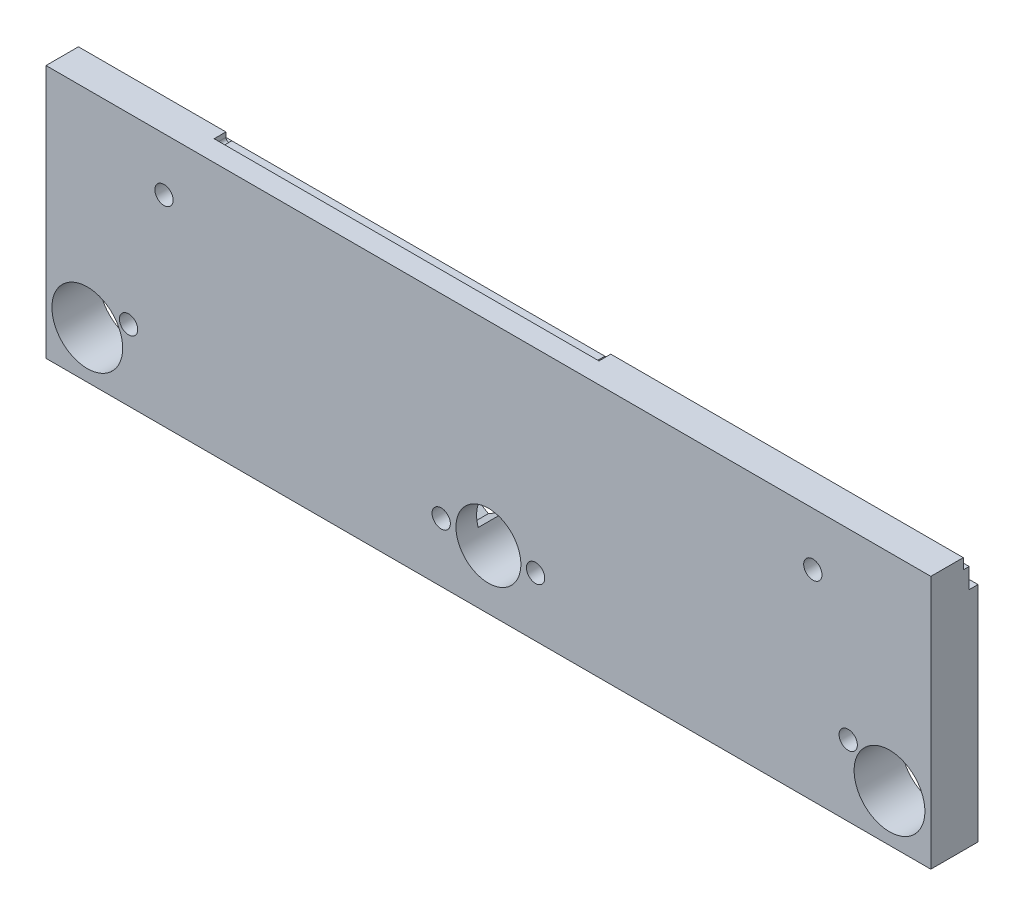
ISO-10303-21;
HEADER;
FILE_DESCRIPTION(('STEP AP214'),'2;1');
FILE_NAME('part.step','',(''),(''),'','','');
FILE_SCHEMA(('AUTOMOTIVE_DESIGN { 1 0 10303 214 1 1 1 1 }'));
ENDSEC;
DATA;
#1=APPLICATION_CONTEXT('core data for automotive mechanical design processes');
#2=APPLICATION_PROTOCOL_DEFINITION('international standard','automotive_design',2000,#1);
#3=PRODUCT_CONTEXT('',#1,'mechanical');
#4=PRODUCT('Part','Part','',(#3));
#5=PRODUCT_RELATED_PRODUCT_CATEGORY('part','',(#4));
#6=PRODUCT_DEFINITION_FORMATION('','',#4);
#7=PRODUCT_DEFINITION_CONTEXT('part definition',#1,'design');
#8=PRODUCT_DEFINITION('design','',#6,#7);
#9=PRODUCT_DEFINITION_SHAPE('','',#8);
#10=(LENGTH_UNIT() NAMED_UNIT(*) SI_UNIT(.MILLI.,.METRE.));
#11=(NAMED_UNIT(*) PLANE_ANGLE_UNIT() SI_UNIT($,.RADIAN.));
#12=(NAMED_UNIT(*) SI_UNIT($,.STERADIAN.) SOLID_ANGLE_UNIT());
#13=UNCERTAINTY_MEASURE_WITH_UNIT(LENGTH_MEASURE(1.E-05),#10,'distance_accuracy_value','');
#14=(GEOMETRIC_REPRESENTATION_CONTEXT(3) GLOBAL_UNCERTAINTY_ASSIGNED_CONTEXT((#13)) GLOBAL_UNIT_ASSIGNED_CONTEXT((#10,
#11,#12)) REPRESENTATION_CONTEXT('',''));
#15=CARTESIAN_POINT('',(0.,0.,0.));
#16=DIRECTION('',(0.,0.,1.));
#17=DIRECTION('',(1.,0.,0.));
#18=AXIS2_PLACEMENT_3D('',#15,#16,#17);
#19=CARTESIAN_POINT('',(67.,10.,0.));
#20=DIRECTION('',(0.,0.,1.));
#21=DIRECTION('',(1.,0.,0.));
#22=AXIS2_PLACEMENT_3D('',#19,#20,#21);
#23=CYLINDRICAL_SURFACE('',#22,1.54999999999999);
#24=CARTESIAN_POINT('',(67.,10.,8.));
#25=DIRECTION('',(0.,0.,1.));
#26=DIRECTION('',(1.,0.,0.));
#27=AXIS2_PLACEMENT_3D('',#24,#25,#26);
#28=CIRCLE('',#27,1.54999999999999);
#29=CARTESIAN_POINT('',(68.55,10.,8.));
#30=VERTEX_POINT('',#29);
#31=EDGE_CURVE('E261',#30,#30,#28,.T.);
#32=ORIENTED_EDGE('',*,*,#31,.T.);
#33=EDGE_LOOP('',(#32));
#34=FACE_BOUND('',#33,.T.);
#35=CARTESIAN_POINT('',(67.,10.,4.5));
#36=DIRECTION('',(0.,0.,-1.));
#37=DIRECTION('',(-1.,0.,0.));
#38=AXIS2_PLACEMENT_3D('',#35,#36,#37);
#39=CIRCLE('',#38,1.54999999999999);
#40=CARTESIAN_POINT('',(65.45,10.,4.5));
#41=VERTEX_POINT('',#40);
#42=EDGE_CURVE('E264',#41,#41,#39,.F.);
#43=ORIENTED_EDGE('',*,*,#42,.F.);
#44=EDGE_LOOP('',(#43));
#45=FACE_BOUND('',#44,.T.);
#46=ADVANCED_FACE('F35',(#34,#45),#23,.F.);
#47=CARTESIAN_POINT('',(83.,10.,0.));
#48=DIRECTION('',(0.,0.,1.));
#49=DIRECTION('',(1.,0.,0.));
#50=AXIS2_PLACEMENT_3D('',#47,#48,#49);
#51=CYLINDRICAL_SURFACE('',#50,1.54999999999999);
#52=CARTESIAN_POINT('',(83.,10.,8.));
#53=DIRECTION('',(0.,0.,1.));
#54=DIRECTION('',(1.,0.,0.));
#55=AXIS2_PLACEMENT_3D('',#52,#53,#54);
#56=CIRCLE('',#55,1.54999999999999);
#57=CARTESIAN_POINT('',(84.55,10.,8.));
#58=VERTEX_POINT('',#57);
#59=EDGE_CURVE('E257',#58,#58,#56,.T.);
#60=ORIENTED_EDGE('',*,*,#59,.T.);
#61=EDGE_LOOP('',(#60));
#62=FACE_BOUND('',#61,.T.);
#63=CARTESIAN_POINT('',(83.,10.,4.5));
#64=DIRECTION('',(0.,0.,-1.));
#65=DIRECTION('',(-1.,0.,0.));
#66=AXIS2_PLACEMENT_3D('',#63,#64,#65);
#67=CIRCLE('',#66,1.54999999999999);
#68=CARTESIAN_POINT('',(81.45,10.,4.5));
#69=VERTEX_POINT('',#68);
#70=EDGE_CURVE('E339',#69,#69,#67,.F.);
#71=ORIENTED_EDGE('',*,*,#70,.F.);
#72=EDGE_LOOP('',(#71));
#73=FACE_BOUND('',#72,.T.);
#74=ADVANCED_FACE('F348',(#62,#73),#51,.F.);
#75=CARTESIAN_POINT('',(0.,0.,8.));
#76=DIRECTION('',(0.,0.,1.));
#77=DIRECTION('',(1.,0.,0.));
#78=AXIS2_PLACEMENT_3D('',#75,#76,#77);
#79=PLANE('',#78);
#80=CARTESIAN_POINT('',(75.,10.,8.));
#81=DIRECTION('',(0.,0.,-1.));
#82=DIRECTION('',(-1.,0.,0.));
#83=AXIS2_PLACEMENT_3D('',#80,#81,#82);
#84=CIRCLE('',#83,5.49999999999999);
#85=CARTESIAN_POINT('',(69.5,10.,8.));
#86=VERTEX_POINT('',#85);
#87=EDGE_CURVE('E228',#86,#86,#84,.T.);
#88=ORIENTED_EDGE('',*,*,#87,.T.);
#89=EDGE_LOOP('',(#88));
#90=FACE_BOUND('',#89,.T.);
#91=CARTESIAN_POINT('',(136.,12.0000000005563,8.));
#92=DIRECTION('',(0.,0.,-1.));
#93=DIRECTION('',(-1.,0.,0.));
#94=AXIS2_PLACEMENT_3D('',#91,#92,#93);
#95=CIRCLE('',#94,1.55000000016251);
#96=CARTESIAN_POINT('',(134.449999999838,12.0000000005563,8.));
#97=VERTEX_POINT('',#96);
#98=EDGE_CURVE('E548',#97,#97,#95,.T.);
#99=ORIENTED_EDGE('',*,*,#98,.T.);
#100=EDGE_LOOP('',(#99));
#101=FACE_BOUND('',#100,.T.);
#102=CARTESIAN_POINT('',(14.,12.0000000005563,8.));
#103=DIRECTION('',(0.,0.,-1.));
#104=DIRECTION('',(1.,0.,0.));
#105=AXIS2_PLACEMENT_3D('',#102,#103,#104);
#106=CIRCLE('',#105,1.55000000016254);
#107=CARTESIAN_POINT('',(15.5500000001626,12.0000000005563,8.));
#108=VERTEX_POINT('',#107);
#109=EDGE_CURVE('E543',#108,#108,#106,.T.);
#110=ORIENTED_EDGE('',*,*,#109,.T.);
#111=EDGE_LOOP('',(#110));
#112=FACE_BOUND('',#111,.T.);
#113=CARTESIAN_POINT('',(130.,34.,8.));
#114=DIRECTION('',(0.,0.,-1.));
#115=DIRECTION('',(-1.,0.,0.));
#116=AXIS2_PLACEMENT_3D('',#113,#114,#115);
#117=CIRCLE('',#116,1.54999999999999);
#118=CARTESIAN_POINT('',(128.45,34.,8.));
#119=VERTEX_POINT('',#118);
#120=EDGE_CURVE('E446',#119,#119,#117,.T.);
#121=ORIENTED_EDGE('',*,*,#120,.T.);
#122=EDGE_LOOP('',(#121));
#123=FACE_BOUND('',#122,.T.);
#124=CARTESIAN_POINT('',(20.,34.,8.));
#125=DIRECTION('',(0.,0.,-1.));
#126=DIRECTION('',(-1.,0.,0.));
#127=AXIS2_PLACEMENT_3D('',#124,#125,#126);
#128=CIRCLE('',#127,1.55);
#129=CARTESIAN_POINT('',(18.45,34.,8.));
#130=VERTEX_POINT('',#129);
#131=EDGE_CURVE('E452',#130,#130,#128,.T.);
#132=ORIENTED_EDGE('',*,*,#131,.T.);
#133=EDGE_LOOP('',(#132));
#134=FACE_BOUND('',#133,.T.);
#135=ORIENTED_EDGE('',*,*,#59,.F.);
#136=EDGE_LOOP('',(#135));
#137=FACE_BOUND('',#136,.T.);
#138=ORIENTED_EDGE('',*,*,#31,.F.);
#139=EDGE_LOOP('',(#138));
#140=FACE_BOUND('',#139,.T.);
#141=DIRECTION('',(0.,-1.,0.));
#142=VECTOR('',#141,1.);
#143=CARTESIAN_POINT('',(0.,43.,8.));
#144=LINE('',#143,#142);
#145=CARTESIAN_POINT('',(0.,43.,8.));
#146=VERTEX_POINT('',#145);
#147=CARTESIAN_POINT('',(0.,0.,8.));
#148=VERTEX_POINT('',#147);
#149=EDGE_CURVE('E313',#146,#148,#144,.T.);
#150=ORIENTED_EDGE('',*,*,#149,.T.);
#151=DIRECTION('',(1.,0.,0.));
#152=VECTOR('',#151,1.);
#153=CARTESIAN_POINT('',(0.,0.,8.));
#154=LINE('',#153,#152);
#155=CARTESIAN_POINT('',(150.,0.,8.));
#156=VERTEX_POINT('',#155);
#157=EDGE_CURVE('E316',#148,#156,#154,.T.);
#158=ORIENTED_EDGE('',*,*,#157,.T.);
#159=DIRECTION('',(0.,1.,0.));
#160=VECTOR('',#159,1.);
#161=CARTESIAN_POINT('',(150.,0.,8.));
#162=LINE('',#161,#160);
#163=CARTESIAN_POINT('',(150.,43.,8.));
#164=VERTEX_POINT('',#163);
#165=EDGE_CURVE('E319',#156,#164,#162,.T.);
#166=ORIENTED_EDGE('',*,*,#165,.T.);
#167=DIRECTION('',(-1.,0.,0.));
#168=VECTOR('',#167,1.);
#169=CARTESIAN_POINT('',(150.,43.,8.));
#170=LINE('',#169,#168);
#171=EDGE_CURVE('E321',#164,#146,#170,.T.);
#172=ORIENTED_EDGE('',*,*,#171,.T.);
#173=EDGE_LOOP('',(#150,#158,#166,#172));
#174=FACE_BOUND('',#173,.T.);
#175=CARTESIAN_POINT('',(7.,8.,8.));
#176=DIRECTION('',(0.,0.,1.));
#177=DIRECTION('',(1.,0.,0.));
#178=AXIS2_PLACEMENT_3D('',#175,#176,#177);
#179=CIRCLE('',#178,6.);
#180=CARTESIAN_POINT('',(13.,8.,8.));
#181=VERTEX_POINT('',#180);
#182=EDGE_CURVE('E307',#181,#181,#179,.T.);
#183=ORIENTED_EDGE('',*,*,#182,.F.);
#184=EDGE_LOOP('',(#183));
#185=FACE_BOUND('',#184,.T.);
#186=CARTESIAN_POINT('',(143.,8.,8.));
#187=DIRECTION('',(0.,0.,1.));
#188=DIRECTION('',(1.,0.,0.));
#189=AXIS2_PLACEMENT_3D('',#186,#187,#188);
#190=CIRCLE('',#189,6.00000000000002);
#191=CARTESIAN_POINT('',(149.,8.,8.));
#192=VERTEX_POINT('',#191);
#193=EDGE_CURVE('E301',#192,#192,#190,.T.);
#194=ORIENTED_EDGE('',*,*,#193,.F.);
#195=EDGE_LOOP('',(#194));
#196=FACE_BOUND('',#195,.T.);
#197=ADVANCED_FACE('F354',(#90,#101,#112,#123,#134,#137,#140,#174,#185,#196),#79,.T.);
#198=CARTESIAN_POINT('',(0.,0.,0.));
#199=DIRECTION('',(0.,0.,1.));
#200=DIRECTION('',(1.,0.,0.));
#201=AXIS2_PLACEMENT_3D('',#198,#199,#200);
#202=PLANE('',#201);
#203=CARTESIAN_POINT('',(136.,12.0000000005563,0.));
#204=DIRECTION('',(0.,0.,-1.));
#205=DIRECTION('',(-1.,0.,0.));
#206=AXIS2_PLACEMENT_3D('',#203,#204,#205);
#207=CIRCLE('',#206,1.55000000016251);
#208=CARTESIAN_POINT('',(134.449999999838,12.0000000005563,0.));
#209=VERTEX_POINT('',#208);
#210=EDGE_CURVE('E552',#209,#209,#207,.T.);
#211=ORIENTED_EDGE('',*,*,#210,.F.);
#212=EDGE_LOOP('',(#211));
#213=FACE_BOUND('',#212,.T.);
#214=CARTESIAN_POINT('',(14.,12.0000000005563,0.));
#215=DIRECTION('',(0.,0.,-1.));
#216=DIRECTION('',(1.,0.,0.));
#217=AXIS2_PLACEMENT_3D('',#214,#215,#216);
#218=CIRCLE('',#217,1.55000000016254);
#219=CARTESIAN_POINT('',(15.5500000001626,12.0000000005563,0.));
#220=VERTEX_POINT('',#219);
#221=EDGE_CURVE('E539',#220,#220,#218,.T.);
#222=ORIENTED_EDGE('',*,*,#221,.F.);
#223=EDGE_LOOP('',(#222));
#224=FACE_BOUND('',#223,.T.);
#225=CARTESIAN_POINT('',(130.,34.,0.));
#226=DIRECTION('',(0.,0.,-1.));
#227=DIRECTION('',(-1.,0.,0.));
#228=AXIS2_PLACEMENT_3D('',#225,#226,#227);
#229=CIRCLE('',#228,1.54999999999999);
#230=CARTESIAN_POINT('',(128.45,34.,0.));
#231=VERTEX_POINT('',#230);
#232=EDGE_CURVE('E449',#231,#231,#229,.T.);
#233=ORIENTED_EDGE('',*,*,#232,.F.);
#234=EDGE_LOOP('',(#233));
#235=FACE_BOUND('',#234,.T.);
#236=CARTESIAN_POINT('',(20.,34.,0.));
#237=DIRECTION('',(0.,0.,-1.));
#238=DIRECTION('',(-1.,0.,0.));
#239=AXIS2_PLACEMENT_3D('',#236,#237,#238);
#240=CIRCLE('',#239,1.55);
#241=CARTESIAN_POINT('',(18.45,34.,0.));
#242=VERTEX_POINT('',#241);
#243=EDGE_CURVE('E455',#242,#242,#240,.T.);
#244=ORIENTED_EDGE('',*,*,#243,.F.);
#245=EDGE_LOOP('',(#244));
#246=FACE_BOUND('',#245,.T.);
#247=DIRECTION('',(0.866025403784438,0.5,0.));
#248=VECTOR('',#247,1.);
#249=CARTESIAN_POINT('',(80.15,11.6454482671904,0.));
#250=LINE('',#249,#248);
#251=CARTESIAN_POINT('',(80.2328562665673,11.6932853549971,0.));
#252=VERTEX_POINT('',#251);
#253=CARTESIAN_POINT('',(83.,13.2908965343809,0.));
#254=VERTEX_POINT('',#253);
#255=EDGE_CURVE('E227',#252,#254,#250,.T.);
#256=ORIENTED_EDGE('',*,*,#255,.F.);
#257=CARTESIAN_POINT('',(75.,10.,0.));
#258=DIRECTION('',(0.,0.,-1.));
#259=DIRECTION('',(-1.,0.,0.));
#260=AXIS2_PLACEMENT_3D('',#257,#258,#259);
#261=CIRCLE('',#260,5.49999999999999);
#262=CARTESIAN_POINT('',(69.7671437334327,11.6932853549971,0.));
#263=VERTEX_POINT('',#262);
#264=EDGE_CURVE('E209',#263,#252,#261,.T.);
#265=ORIENTED_EDGE('',*,*,#264,.F.);
#266=DIRECTION('',(0.866025403784438,-0.5,0.));
#267=VECTOR('',#266,1.);
#268=CARTESIAN_POINT('',(67.,13.2908965343809,0.));
#269=LINE('',#268,#267);
#270=CARTESIAN_POINT('',(67.,13.2908965343809,0.));
#271=VERTEX_POINT('',#270);
#272=EDGE_CURVE('E225',#271,#263,#269,.T.);
#273=ORIENTED_EDGE('',*,*,#272,.F.);
#274=DIRECTION('',(0.866025403784438,0.500000000000002,0.));
#275=VECTOR('',#274,1.);
#276=CARTESIAN_POINT('',(64.15,11.6454482671904,0.));
#277=LINE('',#276,#275);
#278=CARTESIAN_POINT('',(64.15,11.6454482671904,0.));
#279=VERTEX_POINT('',#278);
#280=EDGE_CURVE('E256',#279,#271,#277,.T.);
#281=ORIENTED_EDGE('',*,*,#280,.F.);
#282=DIRECTION('',(0.,1.,0.));
#283=VECTOR('',#282,1.);
#284=CARTESIAN_POINT('',(64.15,8.35455173280956,0.));
#285=LINE('',#284,#283);
#286=CARTESIAN_POINT('',(64.15,8.35455173280956,0.));
#287=VERTEX_POINT('',#286);
#288=EDGE_CURVE('E499',#287,#279,#285,.T.);
#289=ORIENTED_EDGE('',*,*,#288,.F.);
#290=DIRECTION('',(-0.866025403784438,0.500000000000001,0.));
#291=VECTOR('',#290,1.);
#292=CARTESIAN_POINT('',(67.,6.70910346561913,0.));
#293=LINE('',#292,#291);
#294=CARTESIAN_POINT('',(67.,6.70910346561913,0.));
#295=VERTEX_POINT('',#294);
#296=EDGE_CURVE('E238',#295,#287,#293,.T.);
#297=ORIENTED_EDGE('',*,*,#296,.F.);
#298=DIRECTION('',(-0.866025403784438,-0.5,0.));
#299=VECTOR('',#298,1.);
#300=CARTESIAN_POINT('',(69.85,8.35455173280957,0.));
#301=LINE('',#300,#299);
#302=CARTESIAN_POINT('',(69.7671437334327,8.30671464500291,0.));
#303=VERTEX_POINT('',#302);
#304=EDGE_CURVE('E234',#303,#295,#301,.T.);
#305=ORIENTED_EDGE('',*,*,#304,.F.);
#306=CARTESIAN_POINT('',(80.2328562665673,8.30671464500293,0.));
#307=VERTEX_POINT('',#306);
#308=EDGE_CURVE('E50',#307,#303,#261,.T.);
#309=ORIENTED_EDGE('',*,*,#308,.F.);
#310=DIRECTION('',(-0.866025403784439,0.5,0.));
#311=VECTOR('',#310,1.);
#312=CARTESIAN_POINT('',(83.,6.70910346561914,0.));
#313=LINE('',#312,#311);
#314=CARTESIAN_POINT('',(83.,6.70910346561914,0.));
#315=VERTEX_POINT('',#314);
#316=EDGE_CURVE('E479',#315,#307,#313,.T.);
#317=ORIENTED_EDGE('',*,*,#316,.F.);
#318=DIRECTION('',(-0.866025403784438,-0.500000000000001,0.));
#319=VECTOR('',#318,1.);
#320=CARTESIAN_POINT('',(85.85,8.35455173280956,0.));
#321=LINE('',#320,#319);
#322=CARTESIAN_POINT('',(85.85,8.35455173280956,0.));
#323=VERTEX_POINT('',#322);
#324=EDGE_CURVE('E476',#323,#315,#321,.T.);
#325=ORIENTED_EDGE('',*,*,#324,.F.);
#326=DIRECTION('',(0.,-1.,0.));
#327=VECTOR('',#326,1.);
#328=CARTESIAN_POINT('',(85.85,11.6454482671904,0.));
#329=LINE('',#328,#327);
#330=CARTESIAN_POINT('',(85.85,11.6454482671904,0.));
#331=VERTEX_POINT('',#330);
#332=EDGE_CURVE('E236',#331,#323,#329,.T.);
#333=ORIENTED_EDGE('',*,*,#332,.F.);
#334=DIRECTION('',(0.866025403784439,-0.499999999999999,0.));
#335=VECTOR('',#334,1.);
#336=CARTESIAN_POINT('',(83.,13.2908965343809,0.));
#337=LINE('',#336,#335);
#338=EDGE_CURVE('E233',#254,#331,#337,.T.);
#339=ORIENTED_EDGE('',*,*,#338,.F.);
#340=EDGE_LOOP('',(#256,#265,#273,#281,#289,#297,#305,#309,#317,#325,#333,#339));
#341=FACE_BOUND('',#340,.T.);
#342=DIRECTION('',(0.,-1.,0.));
#343=VECTOR('',#342,1.);
#344=CARTESIAN_POINT('',(0.,43.,0.));
#345=LINE('',#344,#343);
#346=CARTESIAN_POINT('',(0.,37.8,0.));
#347=VERTEX_POINT('',#346);
#348=CARTESIAN_POINT('',(0.,0.,0.));
#349=VERTEX_POINT('',#348);
#350=EDGE_CURVE('E310',#347,#349,#345,.T.);
#351=ORIENTED_EDGE('',*,*,#350,.F.);
#352=DIRECTION('',(1.,0.,0.));
#353=VECTOR('',#352,1.);
#354=CARTESIAN_POINT('',(0.,37.8,0.));
#355=LINE('',#354,#353);
#356=CARTESIAN_POINT('',(150.,37.8,0.));
#357=VERTEX_POINT('',#356);
#358=EDGE_CURVE('E288',#347,#357,#355,.T.);
#359=ORIENTED_EDGE('',*,*,#358,.T.);
#360=DIRECTION('',(0.,1.,0.));
#361=VECTOR('',#360,1.);
#362=CARTESIAN_POINT('',(150.,0.,0.));
#363=LINE('',#362,#361);
#364=CARTESIAN_POINT('',(150.,0.,0.));
#365=VERTEX_POINT('',#364);
#366=EDGE_CURVE('E317',#365,#357,#363,.T.);
#367=ORIENTED_EDGE('',*,*,#366,.F.);
#368=DIRECTION('',(1.,0.,0.));
#369=VECTOR('',#368,1.);
#370=CARTESIAN_POINT('',(0.,0.,0.));
#371=LINE('',#370,#369);
#372=EDGE_CURVE('E325',#349,#365,#371,.T.);
#373=ORIENTED_EDGE('',*,*,#372,.F.);
#374=EDGE_LOOP('',(#351,#359,#367,#373));
#375=FACE_BOUND('',#374,.T.);
#376=CARTESIAN_POINT('',(7.,8.,0.));
#377=DIRECTION('',(0.,0.,1.));
#378=DIRECTION('',(1.,0.,0.));
#379=AXIS2_PLACEMENT_3D('',#376,#377,#378);
#380=CIRCLE('',#379,6.);
#381=CARTESIAN_POINT('',(13.,8.,0.));
#382=VERTEX_POINT('',#381);
#383=EDGE_CURVE('E304',#382,#382,#380,.T.);
#384=ORIENTED_EDGE('',*,*,#383,.T.);
#385=EDGE_LOOP('',(#384));
#386=FACE_BOUND('',#385,.T.);
#387=CARTESIAN_POINT('',(143.,8.,0.));
#388=DIRECTION('',(0.,0.,1.));
#389=DIRECTION('',(1.,0.,0.));
#390=AXIS2_PLACEMENT_3D('',#387,#388,#389);
#391=CIRCLE('',#390,6.00000000000002);
#392=CARTESIAN_POINT('',(149.,8.,0.));
#393=VERTEX_POINT('',#392);
#394=EDGE_CURVE('E291',#393,#393,#391,.T.);
#395=ORIENTED_EDGE('',*,*,#394,.T.);
#396=EDGE_LOOP('',(#395));
#397=FACE_BOUND('',#396,.T.);
#398=ADVANCED_FACE('F222',(#213,#224,#235,#246,#341,#375,#386,#397),#202,.F.);
#399=CARTESIAN_POINT('',(0.,43.,8.));
#400=DIRECTION('',(1.,0.,0.));
#401=DIRECTION('',(0.,1.,0.));
#402=AXIS2_PLACEMENT_3D('',#399,#400,#401);
#403=PLANE('',#402);
#404=DIRECTION('',(0.,-1.,0.));
#405=VECTOR('',#404,1.);
#406=CARTESIAN_POINT('',(0.,41.2,1.5));
#407=LINE('',#406,#405);
#408=CARTESIAN_POINT('',(0.,41.2,1.5));
#409=VERTEX_POINT('',#408);
#410=CARTESIAN_POINT('',(0.,37.8,1.5));
#411=VERTEX_POINT('',#410);
#412=EDGE_CURVE('E272',#409,#411,#407,.T.);
#413=ORIENTED_EDGE('',*,*,#412,.T.);
#414=DIRECTION('',(0.,0.,-1.));
#415=VECTOR('',#414,1.);
#416=CARTESIAN_POINT('',(0.,37.8,1.5));
#417=LINE('',#416,#415);
#418=EDGE_CURVE('E275',#411,#347,#417,.T.);
#419=ORIENTED_EDGE('',*,*,#418,.T.);
#420=ORIENTED_EDGE('',*,*,#350,.T.);
#421=DIRECTION('',(0.,0.,-1.));
#422=VECTOR('',#421,1.);
#423=CARTESIAN_POINT('',(0.,0.,8.));
#424=LINE('',#423,#422);
#425=EDGE_CURVE('E43',#148,#349,#424,.T.);
#426=ORIENTED_EDGE('',*,*,#425,.F.);
#427=ORIENTED_EDGE('',*,*,#149,.F.);
#428=DIRECTION('',(0.,0.,-1.));
#429=VECTOR('',#428,1.);
#430=CARTESIAN_POINT('',(0.,43.,8.));
#431=LINE('',#430,#429);
#432=CARTESIAN_POINT('',(0.,43.,2.5));
#433=VERTEX_POINT('',#432);
#434=EDGE_CURVE('E323',#146,#433,#431,.T.);
#435=ORIENTED_EDGE('',*,*,#434,.T.);
#436=DIRECTION('',(0.,-1.,0.));
#437=VECTOR('',#436,1.);
#438=CARTESIAN_POINT('',(0.,41.2,2.5));
#439=LINE('',#438,#437);
#440=CARTESIAN_POINT('',(0.,41.2,2.5));
#441=VERTEX_POINT('',#440);
#442=EDGE_CURVE('E265',#433,#441,#439,.T.);
#443=ORIENTED_EDGE('',*,*,#442,.T.);
#444=DIRECTION('',(0.,0.,-1.));
#445=VECTOR('',#444,1.);
#446=CARTESIAN_POINT('',(0.,41.2,1.5));
#447=LINE('',#446,#445);
#448=EDGE_CURVE('E268',#441,#409,#447,.T.);
#449=ORIENTED_EDGE('',*,*,#448,.T.);
#450=EDGE_LOOP('',(#413,#419,#420,#426,#427,#435,#443,#449));
#451=FACE_BOUND('',#450,.T.);
#452=ADVANCED_FACE('F37',(#451),#403,.F.);
#453=CARTESIAN_POINT('',(0.,0.,8.));
#454=DIRECTION('',(0.,1.,0.));
#455=DIRECTION('',(0.,0.,1.));
#456=AXIS2_PLACEMENT_3D('',#453,#454,#455);
#457=PLANE('',#456);
#458=ORIENTED_EDGE('',*,*,#372,.T.);
#459=DIRECTION('',(0.,0.,-1.));
#460=VECTOR('',#459,1.);
#461=CARTESIAN_POINT('',(150.,0.,8.));
#462=LINE('',#461,#460);
#463=EDGE_CURVE('E334',#156,#365,#462,.T.);
#464=ORIENTED_EDGE('',*,*,#463,.F.);
#465=ORIENTED_EDGE('',*,*,#157,.F.);
#466=ORIENTED_EDGE('',*,*,#425,.T.);
#467=EDGE_LOOP('',(#458,#464,#465,#466));
#468=FACE_BOUND('',#467,.T.);
#469=ADVANCED_FACE('F396',(#468),#457,.F.);
#470=CARTESIAN_POINT('',(150.,0.,8.));
#471=DIRECTION('',(-1.,0.,0.));
#472=DIRECTION('',(0.,-1.,0.));
#473=AXIS2_PLACEMENT_3D('',#470,#471,#472);
#474=PLANE('',#473);
#475=ORIENTED_EDGE('',*,*,#366,.T.);
#476=DIRECTION('',(0.,0.,-1.));
#477=VECTOR('',#476,1.);
#478=CARTESIAN_POINT('',(150.,37.8,1.5));
#479=LINE('',#478,#477);
#480=CARTESIAN_POINT('',(150.,37.8,1.5));
#481=VERTEX_POINT('',#480);
#482=EDGE_CURVE('E269',#481,#357,#479,.T.);
#483=ORIENTED_EDGE('',*,*,#482,.F.);
#484=DIRECTION('',(0.,-1.,0.));
#485=VECTOR('',#484,1.);
#486=CARTESIAN_POINT('',(150.,41.2,1.5));
#487=LINE('',#486,#485);
#488=CARTESIAN_POINT('',(150.,41.2,1.5));
#489=VERTEX_POINT('',#488);
#490=EDGE_CURVE('E284',#489,#481,#487,.T.);
#491=ORIENTED_EDGE('',*,*,#490,.F.);
#492=DIRECTION('',(0.,0.,-1.));
#493=VECTOR('',#492,1.);
#494=CARTESIAN_POINT('',(150.,41.2,1.5));
#495=LINE('',#494,#493);
#496=CARTESIAN_POINT('',(150.,41.2,2.5));
#497=VERTEX_POINT('',#496);
#498=EDGE_CURVE('E281',#497,#489,#495,.T.);
#499=ORIENTED_EDGE('',*,*,#498,.F.);
#500=DIRECTION('',(0.,-1.,0.));
#501=VECTOR('',#500,1.);
#502=CARTESIAN_POINT('',(150.,41.2,2.5));
#503=LINE('',#502,#501);
#504=CARTESIAN_POINT('',(150.,43.,2.5));
#505=VERTEX_POINT('',#504);
#506=EDGE_CURVE('E260',#505,#497,#503,.T.);
#507=ORIENTED_EDGE('',*,*,#506,.F.);
#508=DIRECTION('',(0.,0.,-1.));
#509=VECTOR('',#508,1.);
#510=CARTESIAN_POINT('',(150.,43.,8.));
#511=LINE('',#510,#509);
#512=EDGE_CURVE('E331',#164,#505,#511,.T.);
#513=ORIENTED_EDGE('',*,*,#512,.F.);
#514=ORIENTED_EDGE('',*,*,#165,.F.);
#515=ORIENTED_EDGE('',*,*,#463,.T.);
#516=EDGE_LOOP('',(#475,#483,#491,#499,#507,#513,#514,#515));
#517=FACE_BOUND('',#516,.T.);
#518=ADVANCED_FACE('F393',(#517),#474,.F.);
#519=CARTESIAN_POINT('',(150.,43.,8.));
#520=DIRECTION('',(0.,-1.,0.));
#521=DIRECTION('',(1.,0.,0.));
#522=AXIS2_PLACEMENT_3D('',#519,#520,#521);
#523=PLANE('',#522);
#524=DIRECTION('',(1.,0.,0.));
#525=VECTOR('',#524,1.);
#526=CARTESIAN_POINT('',(25.000000000049,43.,4.5));
#527=LINE('',#526,#525);
#528=CARTESIAN_POINT('',(25.000000000049,43.,4.5));
#529=VERTEX_POINT('',#528);
#530=CARTESIAN_POINT('',(90.2479381778135,43.,4.5));
#531=VERTEX_POINT('',#530);
#532=EDGE_CURVE('E433',#529,#531,#527,.T.);
#533=ORIENTED_EDGE('',*,*,#532,.F.);
#534=DIRECTION('',(0.,0.,-1.));
#535=VECTOR('',#534,1.);
#536=CARTESIAN_POINT('',(25.000000000049,43.,4.5));
#537=LINE('',#536,#535);
#538=CARTESIAN_POINT('',(25.000000000049,43.,2.5));
#539=VERTEX_POINT('',#538);
#540=EDGE_CURVE('E431',#529,#539,#537,.T.);
#541=ORIENTED_EDGE('',*,*,#540,.T.);
#542=DIRECTION('',(1.,0.,0.));
#543=VECTOR('',#542,1.);
#544=CARTESIAN_POINT('',(0.,43.,2.5));
#545=LINE('',#544,#543);
#546=EDGE_CURVE('E298',#433,#539,#545,.T.);
#547=ORIENTED_EDGE('',*,*,#546,.F.);
#548=ORIENTED_EDGE('',*,*,#434,.F.);
#549=ORIENTED_EDGE('',*,*,#171,.F.);
#550=ORIENTED_EDGE('',*,*,#512,.T.);
#551=CARTESIAN_POINT('',(90.2479381778135,43.,2.5));
#552=VERTEX_POINT('',#551);
#553=EDGE_CURVE('E278',#552,#505,#545,.T.);
#554=ORIENTED_EDGE('',*,*,#553,.F.);
#555=DIRECTION('',(0.,0.,-1.));
#556=VECTOR('',#555,1.);
#557=CARTESIAN_POINT('',(90.2479381778135,43.,4.5));
#558=LINE('',#557,#556);
#559=EDGE_CURVE('E57',#531,#552,#558,.T.);
#560=ORIENTED_EDGE('',*,*,#559,.F.);
#561=EDGE_LOOP('',(#533,#541,#547,#548,#549,#550,#554,#560));
#562=FACE_BOUND('',#561,.T.);
#563=ADVANCED_FACE('F383',(#562),#523,.F.);
#564=CARTESIAN_POINT('',(7.,8.,8.));
#565=DIRECTION('',(0.,0.,-1.));
#566=DIRECTION('',(-1.,0.,0.));
#567=AXIS2_PLACEMENT_3D('',#564,#565,#566);
#568=CYLINDRICAL_SURFACE('',#567,6.);
#569=ORIENTED_EDGE('',*,*,#182,.T.);
#570=EDGE_LOOP('',(#569));
#571=FACE_BOUND('',#570,.T.);
#572=ORIENTED_EDGE('',*,*,#383,.F.);
#573=EDGE_LOOP('',(#572));
#574=FACE_BOUND('',#573,.T.);
#575=ADVANCED_FACE('F379',(#571,#574),#568,.F.);
#576=CARTESIAN_POINT('',(143.,8.,8.));
#577=DIRECTION('',(0.,0.,-1.));
#578=DIRECTION('',(-1.,0.,0.));
#579=AXIS2_PLACEMENT_3D('',#576,#577,#578);
#580=CYLINDRICAL_SURFACE('',#579,6.00000000000002);
#581=ORIENTED_EDGE('',*,*,#193,.T.);
#582=EDGE_LOOP('',(#581));
#583=FACE_BOUND('',#582,.T.);
#584=ORIENTED_EDGE('',*,*,#394,.F.);
#585=EDGE_LOOP('',(#584));
#586=FACE_BOUND('',#585,.T.);
#587=ADVANCED_FACE('F363',(#583,#586),#580,.F.);
#588=CARTESIAN_POINT('',(0.,37.8,1.5));
#589=DIRECTION('',(0.,-1.,0.));
#590=DIRECTION('',(0.,0.,-1.));
#591=AXIS2_PLACEMENT_3D('',#588,#589,#590);
#592=PLANE('',#591);
#593=ORIENTED_EDGE('',*,*,#482,.T.);
#594=ORIENTED_EDGE('',*,*,#358,.F.);
#595=ORIENTED_EDGE('',*,*,#418,.F.);
#596=DIRECTION('',(1.,0.,0.));
#597=VECTOR('',#596,1.);
#598=CARTESIAN_POINT('',(0.,37.8,1.5));
#599=LINE('',#598,#597);
#600=EDGE_CURVE('E292',#411,#481,#599,.T.);
#601=ORIENTED_EDGE('',*,*,#600,.T.);
#602=EDGE_LOOP('',(#593,#594,#595,#601));
#603=FACE_BOUND('',#602,.T.);
#604=ADVANCED_FACE('F359',(#603),#592,.F.);
#605=CARTESIAN_POINT('',(0.,41.2,1.5));
#606=DIRECTION('',(0.,0.,1.));
#607=DIRECTION('',(0.,-1.,0.));
#608=AXIS2_PLACEMENT_3D('',#605,#606,#607);
#609=PLANE('',#608);
#610=ORIENTED_EDGE('',*,*,#490,.T.);
#611=ORIENTED_EDGE('',*,*,#600,.F.);
#612=ORIENTED_EDGE('',*,*,#412,.F.);
#613=DIRECTION('',(1.,0.,0.));
#614=VECTOR('',#613,1.);
#615=CARTESIAN_POINT('',(0.,41.2,1.5));
#616=LINE('',#615,#614);
#617=EDGE_CURVE('E294',#409,#489,#616,.T.);
#618=ORIENTED_EDGE('',*,*,#617,.T.);
#619=EDGE_LOOP('',(#610,#611,#612,#618));
#620=FACE_BOUND('',#619,.T.);
#621=ADVANCED_FACE('F362',(#620),#609,.F.);
#622=CARTESIAN_POINT('',(0.,41.2,1.5));
#623=DIRECTION('',(0.,-1.,0.));
#624=DIRECTION('',(0.,0.,-1.));
#625=AXIS2_PLACEMENT_3D('',#622,#623,#624);
#626=PLANE('',#625);
#627=ORIENTED_EDGE('',*,*,#498,.T.);
#628=ORIENTED_EDGE('',*,*,#617,.F.);
#629=ORIENTED_EDGE('',*,*,#448,.F.);
#630=DIRECTION('',(1.,0.,0.));
#631=VECTOR('',#630,1.);
#632=CARTESIAN_POINT('',(0.,41.2,2.5));
#633=LINE('',#632,#631);
#634=EDGE_CURVE('E296',#441,#497,#633,.T.);
#635=ORIENTED_EDGE('',*,*,#634,.T.);
#636=EDGE_LOOP('',(#627,#628,#629,#635));
#637=FACE_BOUND('',#636,.T.);
#638=ADVANCED_FACE('F367',(#637),#626,.F.);
#639=CARTESIAN_POINT('',(0.,41.2,2.5));
#640=DIRECTION('',(0.,0.,1.));
#641=DIRECTION('',(1.,0.,0.));
#642=AXIS2_PLACEMENT_3D('',#639,#640,#641);
#643=PLANE('',#642);
#644=ORIENTED_EDGE('',*,*,#546,.T.);
#645=DIRECTION('',(0.,1.,0.));
#646=VECTOR('',#645,1.);
#647=CARTESIAN_POINT('',(25.000000000049,43.,2.5));
#648=LINE('',#647,#646);
#649=CARTESIAN_POINT('',(25.000000000049,42.2,2.5));
#650=VERTEX_POINT('',#649);
#651=EDGE_CURVE('E551',#650,#539,#648,.T.);
#652=ORIENTED_EDGE('',*,*,#651,.F.);
#653=CARTESIAN_POINT('',(25.500000000049,42.2,2.5));
#654=DIRECTION('',(0.,0.,-1.));
#655=DIRECTION('',(-1.,0.,0.));
#656=AXIS2_PLACEMENT_3D('',#653,#654,#655);
#657=CIRCLE('',#656,0.500000000000002);
#658=CARTESIAN_POINT('',(26.000000000049,42.2,2.5));
#659=VERTEX_POINT('',#658);
#660=EDGE_CURVE('E559',#659,#650,#657,.T.);
#661=ORIENTED_EDGE('',*,*,#660,.F.);
#662=DIRECTION('',(-1.,0.,0.));
#663=VECTOR('',#662,1.);
#664=CARTESIAN_POINT('',(26.000000000049,42.2,2.5));
#665=LINE('',#664,#663);
#666=CARTESIAN_POINT('',(89.2479381778135,42.2,2.5));
#667=VERTEX_POINT('',#666);
#668=EDGE_CURVE('E574',#667,#659,#665,.T.);
#669=ORIENTED_EDGE('',*,*,#668,.F.);
#670=CARTESIAN_POINT('',(89.7479381778135,42.2,2.5));
#671=DIRECTION('',(0.,0.,-1.));
#672=DIRECTION('',(-1.,0.,0.));
#673=AXIS2_PLACEMENT_3D('',#670,#671,#672);
#674=CIRCLE('',#673,0.500000000000007);
#675=CARTESIAN_POINT('',(90.2479381778135,42.2,2.5));
#676=VERTEX_POINT('',#675);
#677=EDGE_CURVE('E571',#676,#667,#674,.T.);
#678=ORIENTED_EDGE('',*,*,#677,.F.);
#679=DIRECTION('',(0.,-1.,0.));
#680=VECTOR('',#679,1.);
#681=CARTESIAN_POINT('',(90.2479381778135,43.,2.5));
#682=LINE('',#681,#680);
#683=EDGE_CURVE('E421',#552,#676,#682,.T.);
#684=ORIENTED_EDGE('',*,*,#683,.F.);
#685=ORIENTED_EDGE('',*,*,#553,.T.);
#686=ORIENTED_EDGE('',*,*,#506,.T.);
#687=ORIENTED_EDGE('',*,*,#634,.F.);
#688=ORIENTED_EDGE('',*,*,#442,.F.);
#689=EDGE_LOOP('',(#644,#652,#661,#669,#678,#684,#685,#686,#687,#688));
#690=FACE_BOUND('',#689,.T.);
#691=ADVANCED_FACE('F371',(#690),#643,.F.);
#692=CARTESIAN_POINT('',(0.,0.,4.5));
#693=DIRECTION('',(0.,0.,-1.));
#694=DIRECTION('',(-1.,0.,0.));
#695=AXIS2_PLACEMENT_3D('',#692,#693,#694);
#696=PLANE('',#695);
#697=CARTESIAN_POINT('',(75.,10.,4.5));
#698=DIRECTION('',(0.,0.,-1.));
#699=DIRECTION('',(-1.,0.,0.));
#700=AXIS2_PLACEMENT_3D('',#697,#698,#699);
#701=CIRCLE('',#700,5.49999999999999);
#702=CARTESIAN_POINT('',(80.2328562665673,11.6932853549971,4.5));
#703=VERTEX_POINT('',#702);
#704=CARTESIAN_POINT('',(80.2328562665673,8.30671464500293,4.5));
#705=VERTEX_POINT('',#704);
#706=EDGE_CURVE('E540',#703,#705,#701,.T.);
#707=ORIENTED_EDGE('',*,*,#706,.F.);
#708=DIRECTION('',(0.866025403784438,0.5,0.));
#709=VECTOR('',#708,1.);
#710=CARTESIAN_POINT('',(80.15,11.6454482671904,4.5));
#711=LINE('',#710,#709);
#712=CARTESIAN_POINT('',(83.,13.2908965343809,4.5));
#713=VERTEX_POINT('',#712);
#714=EDGE_CURVE('E471',#703,#713,#711,.T.);
#715=ORIENTED_EDGE('',*,*,#714,.T.);
#716=DIRECTION('',(0.866025403784439,-0.499999999999999,0.));
#717=VECTOR('',#716,1.);
#718=CARTESIAN_POINT('',(83.,13.2908965343809,4.5));
#719=LINE('',#718,#717);
#720=CARTESIAN_POINT('',(85.85,11.6454482671904,4.5));
#721=VERTEX_POINT('',#720);
#722=EDGE_CURVE('E459',#713,#721,#719,.T.);
#723=ORIENTED_EDGE('',*,*,#722,.T.);
#724=DIRECTION('',(0.,-1.,0.));
#725=VECTOR('',#724,1.);
#726=CARTESIAN_POINT('',(85.85,11.6454482671904,4.5));
#727=LINE('',#726,#725);
#728=CARTESIAN_POINT('',(85.85,8.35455173280956,4.5));
#729=VERTEX_POINT('',#728);
#730=EDGE_CURVE('E462',#721,#729,#727,.T.);
#731=ORIENTED_EDGE('',*,*,#730,.T.);
#732=DIRECTION('',(-0.866025403784438,-0.500000000000001,0.));
#733=VECTOR('',#732,1.);
#734=CARTESIAN_POINT('',(85.85,8.35455173280956,4.5));
#735=LINE('',#734,#733);
#736=CARTESIAN_POINT('',(83.,6.70910346561914,4.5));
#737=VERTEX_POINT('',#736);
#738=EDGE_CURVE('E465',#729,#737,#735,.T.);
#739=ORIENTED_EDGE('',*,*,#738,.T.);
#740=DIRECTION('',(-0.866025403784439,0.5,0.));
#741=VECTOR('',#740,1.);
#742=CARTESIAN_POINT('',(83.,6.70910346561914,4.5));
#743=LINE('',#742,#741);
#744=EDGE_CURVE('E468',#737,#705,#743,.T.);
#745=ORIENTED_EDGE('',*,*,#744,.T.);
#746=EDGE_LOOP('',(#707,#715,#723,#731,#739,#745));
#747=FACE_BOUND('',#746,.T.);
#748=ORIENTED_EDGE('',*,*,#70,.T.);
#749=EDGE_LOOP('',(#748));
#750=FACE_BOUND('',#749,.T.);
#751=ADVANCED_FACE('F375',(#747,#750),#696,.T.);
#752=CARTESIAN_POINT('',(83.,13.2908965343809,4.5));
#753=DIRECTION('',(0.499999999999999,0.866025403784439,0.));
#754=DIRECTION('',(-0.866025403784439,0.499999999999999,0.));
#755=AXIS2_PLACEMENT_3D('',#752,#753,#754);
#756=PLANE('',#755);
#757=ORIENTED_EDGE('',*,*,#338,.T.);
#758=DIRECTION('',(0.,0.,-1.));
#759=VECTOR('',#758,1.);
#760=CARTESIAN_POINT('',(85.85,11.6454482671904,4.5));
#761=LINE('',#760,#759);
#762=EDGE_CURVE('E472',#721,#331,#761,.T.);
#763=ORIENTED_EDGE('',*,*,#762,.F.);
#764=ORIENTED_EDGE('',*,*,#722,.F.);
#765=DIRECTION('',(0.,0.,-1.));
#766=VECTOR('',#765,1.);
#767=CARTESIAN_POINT('',(83.,13.2908965343809,4.5));
#768=LINE('',#767,#766);
#769=EDGE_CURVE('E341',#713,#254,#768,.T.);
#770=ORIENTED_EDGE('',*,*,#769,.T.);
#771=EDGE_LOOP('',(#757,#763,#764,#770));
#772=FACE_BOUND('',#771,.T.);
#773=ADVANCED_FACE('F532',(#772),#756,.F.);
#774=CARTESIAN_POINT('',(80.15,11.6454482671904,4.5));
#775=DIRECTION('',(-0.5,0.866025403784438,0.));
#776=DIRECTION('',(-0.866025403784438,-0.5,0.));
#777=AXIS2_PLACEMENT_3D('',#774,#775,#776);
#778=PLANE('',#777);
#779=ORIENTED_EDGE('',*,*,#714,.F.);
#780=DIRECTION('',(0.,0.,-1.));
#781=VECTOR('',#780,1.);
#782=CARTESIAN_POINT('',(80.2328562665673,11.6932853549971,8.));
#783=LINE('',#782,#781);
#784=EDGE_CURVE('E537',#703,#252,#783,.T.);
#785=ORIENTED_EDGE('',*,*,#784,.T.);
#786=ORIENTED_EDGE('',*,*,#255,.T.);
#787=ORIENTED_EDGE('',*,*,#769,.F.);
#788=EDGE_LOOP('',(#779,#785,#786,#787));
#789=FACE_BOUND('',#788,.T.);
#790=ADVANCED_FACE('F536',(#789),#778,.F.);
#791=CARTESIAN_POINT('',(83.,6.70910346561914,4.5));
#792=DIRECTION('',(-0.5,-0.866025403784439,0.));
#793=DIRECTION('',(0.866025403784439,-0.5,0.));
#794=AXIS2_PLACEMENT_3D('',#791,#792,#793);
#795=PLANE('',#794);
#796=ORIENTED_EDGE('',*,*,#316,.T.);
#797=DIRECTION('',(0.,0.,-1.));
#798=VECTOR('',#797,1.);
#799=CARTESIAN_POINT('',(80.2328562665673,8.30671464500293,8.));
#800=LINE('',#799,#798);
#801=EDGE_CURVE('E217',#307,#705,#800,.F.);
#802=ORIENTED_EDGE('',*,*,#801,.T.);
#803=ORIENTED_EDGE('',*,*,#744,.F.);
#804=DIRECTION('',(0.,0.,-1.));
#805=VECTOR('',#804,1.);
#806=CARTESIAN_POINT('',(83.,6.70910346561914,4.5));
#807=LINE('',#806,#805);
#808=EDGE_CURVE('E485',#737,#315,#807,.T.);
#809=ORIENTED_EDGE('',*,*,#808,.T.);
#810=EDGE_LOOP('',(#796,#802,#803,#809));
#811=FACE_BOUND('',#810,.T.);
#812=ADVANCED_FACE('F521',(#811),#795,.F.);
#813=CARTESIAN_POINT('',(85.85,8.35455173280956,4.5));
#814=DIRECTION('',(0.5,-0.866025403784438,0.));
#815=DIRECTION('',(0.866025403784438,0.500000000000001,0.));
#816=AXIS2_PLACEMENT_3D('',#813,#814,#815);
#817=PLANE('',#816);
#818=ORIENTED_EDGE('',*,*,#324,.T.);
#819=ORIENTED_EDGE('',*,*,#808,.F.);
#820=ORIENTED_EDGE('',*,*,#738,.F.);
#821=DIRECTION('',(0.,0.,-1.));
#822=VECTOR('',#821,1.);
#823=CARTESIAN_POINT('',(85.85,8.35455173280956,4.5));
#824=LINE('',#823,#822);
#825=EDGE_CURVE('E487',#729,#323,#824,.T.);
#826=ORIENTED_EDGE('',*,*,#825,.T.);
#827=EDGE_LOOP('',(#818,#819,#820,#826));
#828=FACE_BOUND('',#827,.T.);
#829=ADVANCED_FACE('F525',(#828),#817,.F.);
#830=CARTESIAN_POINT('',(85.85,11.6454482671904,4.5));
#831=DIRECTION('',(1.,0.,0.));
#832=DIRECTION('',(0.,0.,-1.));
#833=AXIS2_PLACEMENT_3D('',#830,#831,#832);
#834=PLANE('',#833);
#835=ORIENTED_EDGE('',*,*,#332,.T.);
#836=ORIENTED_EDGE('',*,*,#825,.F.);
#837=ORIENTED_EDGE('',*,*,#730,.F.);
#838=ORIENTED_EDGE('',*,*,#762,.T.);
#839=EDGE_LOOP('',(#835,#836,#837,#838));
#840=FACE_BOUND('',#839,.T.);
#841=ADVANCED_FACE('F528',(#840),#834,.F.);
#842=CARTESIAN_POINT('',(0.,0.,4.5));
#843=DIRECTION('',(0.,0.,-1.));
#844=DIRECTION('',(-1.,0.,0.));
#845=AXIS2_PLACEMENT_3D('',#842,#843,#844);
#846=PLANE('',#845);
#847=CARTESIAN_POINT('',(75.,10.,4.5));
#848=DIRECTION('',(0.,0.,-1.));
#849=DIRECTION('',(-1.,0.,0.));
#850=AXIS2_PLACEMENT_3D('',#847,#848,#849);
#851=CIRCLE('',#850,5.49999999999999);
#852=CARTESIAN_POINT('',(69.7671437334327,8.30671464500291,4.5));
#853=VERTEX_POINT('',#852);
#854=CARTESIAN_POINT('',(69.7671437334327,11.6932853549971,4.5));
#855=VERTEX_POINT('',#854);
#856=EDGE_CURVE('E212',#853,#855,#851,.T.);
#857=ORIENTED_EDGE('',*,*,#856,.F.);
#858=DIRECTION('',(-0.866025403784438,-0.5,0.));
#859=VECTOR('',#858,1.);
#860=CARTESIAN_POINT('',(69.85,8.35455173280957,4.5));
#861=LINE('',#860,#859);
#862=CARTESIAN_POINT('',(67.,6.70910346561913,4.5));
#863=VERTEX_POINT('',#862);
#864=EDGE_CURVE('E252',#853,#863,#861,.T.);
#865=ORIENTED_EDGE('',*,*,#864,.T.);
#866=DIRECTION('',(-0.866025403784438,0.500000000000001,0.));
#867=VECTOR('',#866,1.);
#868=CARTESIAN_POINT('',(67.,6.70910346561913,4.5));
#869=LINE('',#868,#867);
#870=CARTESIAN_POINT('',(64.15,8.35455173280956,4.5));
#871=VERTEX_POINT('',#870);
#872=EDGE_CURVE('E249',#863,#871,#869,.T.);
#873=ORIENTED_EDGE('',*,*,#872,.T.);
#874=DIRECTION('',(0.,1.,0.));
#875=VECTOR('',#874,1.);
#876=CARTESIAN_POINT('',(64.15,8.35455173280956,4.5));
#877=LINE('',#876,#875);
#878=CARTESIAN_POINT('',(64.15,11.6454482671904,4.5));
#879=VERTEX_POINT('',#878);
#880=EDGE_CURVE('E245',#871,#879,#877,.T.);
#881=ORIENTED_EDGE('',*,*,#880,.T.);
#882=DIRECTION('',(0.866025403784438,0.500000000000002,0.));
#883=VECTOR('',#882,1.);
#884=CARTESIAN_POINT('',(64.15,11.6454482671904,4.5));
#885=LINE('',#884,#883);
#886=CARTESIAN_POINT('',(67.,13.2908965343809,4.5));
#887=VERTEX_POINT('',#886);
#888=EDGE_CURVE('E242',#879,#887,#885,.T.);
#889=ORIENTED_EDGE('',*,*,#888,.T.);
#890=DIRECTION('',(0.866025403784438,-0.5,0.));
#891=VECTOR('',#890,1.);
#892=CARTESIAN_POINT('',(67.,13.2908965343809,4.5));
#893=LINE('',#892,#891);
#894=EDGE_CURVE('E254',#887,#855,#893,.T.);
#895=ORIENTED_EDGE('',*,*,#894,.T.);
#896=EDGE_LOOP('',(#857,#865,#873,#881,#889,#895));
#897=FACE_BOUND('',#896,.T.);
#898=ORIENTED_EDGE('',*,*,#42,.T.);
#899=EDGE_LOOP('',(#898));
#900=FACE_BOUND('',#899,.T.);
#901=ADVANCED_FACE('F345',(#897,#900),#846,.T.);
#902=CARTESIAN_POINT('',(67.,13.2908965343809,4.5));
#903=DIRECTION('',(0.5,0.866025403784439,0.));
#904=DIRECTION('',(-0.866025403784439,0.5,0.));
#905=AXIS2_PLACEMENT_3D('',#902,#903,#904);
#906=PLANE('',#905);
#907=ORIENTED_EDGE('',*,*,#272,.T.);
#908=DIRECTION('',(0.,0.,-1.));
#909=VECTOR('',#908,1.);
#910=CARTESIAN_POINT('',(69.7671437334327,11.6932853549971,8.));
#911=LINE('',#910,#909);
#912=EDGE_CURVE('E206',#263,#855,#911,.F.);
#913=ORIENTED_EDGE('',*,*,#912,.T.);
#914=ORIENTED_EDGE('',*,*,#894,.F.);
#915=DIRECTION('',(0.,0.,-1.));
#916=VECTOR('',#915,1.);
#917=CARTESIAN_POINT('',(67.,13.2908965343809,4.5));
#918=LINE('',#917,#916);
#919=EDGE_CURVE('E231',#887,#271,#918,.T.);
#920=ORIENTED_EDGE('',*,*,#919,.T.);
#921=EDGE_LOOP('',(#907,#913,#914,#920));
#922=FACE_BOUND('',#921,.T.);
#923=ADVANCED_FACE('F230',(#922),#906,.F.);
#924=CARTESIAN_POINT('',(64.15,11.6454482671904,4.5));
#925=DIRECTION('',(-0.500000000000002,0.866025403784438,0.));
#926=DIRECTION('',(-0.866025403784438,-0.500000000000002,0.));
#927=AXIS2_PLACEMENT_3D('',#924,#925,#926);
#928=PLANE('',#927);
#929=ORIENTED_EDGE('',*,*,#280,.T.);
#930=ORIENTED_EDGE('',*,*,#919,.F.);
#931=ORIENTED_EDGE('',*,*,#888,.F.);
#932=DIRECTION('',(0.,0.,-1.));
#933=VECTOR('',#932,1.);
#934=CARTESIAN_POINT('',(64.15,11.6454482671904,4.5));
#935=LINE('',#934,#933);
#936=EDGE_CURVE('E495',#879,#279,#935,.T.);
#937=ORIENTED_EDGE('',*,*,#936,.T.);
#938=EDGE_LOOP('',(#929,#930,#931,#937));
#939=FACE_BOUND('',#938,.T.);
#940=ADVANCED_FACE('F636',(#939),#928,.F.);
#941=CARTESIAN_POINT('',(64.15,8.35455173280956,4.5));
#942=DIRECTION('',(-1.,0.,0.));
#943=DIRECTION('',(0.,0.,1.));
#944=AXIS2_PLACEMENT_3D('',#941,#942,#943);
#945=PLANE('',#944);
#946=ORIENTED_EDGE('',*,*,#288,.T.);
#947=ORIENTED_EDGE('',*,*,#936,.F.);
#948=ORIENTED_EDGE('',*,*,#880,.F.);
#949=DIRECTION('',(0.,0.,-1.));
#950=VECTOR('',#949,1.);
#951=CARTESIAN_POINT('',(64.15,8.35455173280956,4.5));
#952=LINE('',#951,#950);
#953=EDGE_CURVE('E493',#871,#287,#952,.T.);
#954=ORIENTED_EDGE('',*,*,#953,.T.);
#955=EDGE_LOOP('',(#946,#947,#948,#954));
#956=FACE_BOUND('',#955,.T.);
#957=ADVANCED_FACE('F511',(#956),#945,.F.);
#958=CARTESIAN_POINT('',(67.,6.70910346561913,4.5));
#959=DIRECTION('',(-0.500000000000001,-0.866025403784438,0.));
#960=DIRECTION('',(0.866025403784438,-0.500000000000001,0.));
#961=AXIS2_PLACEMENT_3D('',#958,#959,#960);
#962=PLANE('',#961);
#963=ORIENTED_EDGE('',*,*,#296,.T.);
#964=ORIENTED_EDGE('',*,*,#953,.F.);
#965=ORIENTED_EDGE('',*,*,#872,.F.);
#966=DIRECTION('',(0.,0.,-1.));
#967=VECTOR('',#966,1.);
#968=CARTESIAN_POINT('',(67.,6.70910346561913,4.5));
#969=LINE('',#968,#967);
#970=EDGE_CURVE('E246',#863,#295,#969,.T.);
#971=ORIENTED_EDGE('',*,*,#970,.T.);
#972=EDGE_LOOP('',(#963,#964,#965,#971));
#973=FACE_BOUND('',#972,.T.);
#974=ADVANCED_FACE('F505',(#973),#962,.F.);
#975=CARTESIAN_POINT('',(69.85,8.35455173280957,4.5));
#976=DIRECTION('',(0.5,-0.866025403784439,0.));
#977=DIRECTION('',(0.866025403784439,0.5,0.));
#978=AXIS2_PLACEMENT_3D('',#975,#976,#977);
#979=PLANE('',#978);
#980=ORIENTED_EDGE('',*,*,#864,.F.);
#981=DIRECTION('',(0.,0.,-1.));
#982=VECTOR('',#981,1.);
#983=CARTESIAN_POINT('',(69.7671437334327,8.30671464500291,8.));
#984=LINE('',#983,#982);
#985=EDGE_CURVE('E11',#853,#303,#984,.T.);
#986=ORIENTED_EDGE('',*,*,#985,.T.);
#987=ORIENTED_EDGE('',*,*,#304,.T.);
#988=ORIENTED_EDGE('',*,*,#970,.F.);
#989=EDGE_LOOP('',(#980,#986,#987,#988));
#990=FACE_BOUND('',#989,.T.);
#991=ADVANCED_FACE('F516',(#990),#979,.F.);
#992=CARTESIAN_POINT('',(20.,34.,8.));
#993=DIRECTION('',(0.,0.,-1.));
#994=DIRECTION('',(-1.,0.,0.));
#995=AXIS2_PLACEMENT_3D('',#992,#993,#994);
#996=CYLINDRICAL_SURFACE('',#995,1.55);
#997=ORIENTED_EDGE('',*,*,#131,.F.);
#998=EDGE_LOOP('',(#997));
#999=FACE_BOUND('',#998,.T.);
#1000=ORIENTED_EDGE('',*,*,#243,.T.);
#1001=EDGE_LOOP('',(#1000));
#1002=FACE_BOUND('',#1001,.T.);
#1003=ADVANCED_FACE('F616',(#999,#1002),#996,.F.);
#1004=CARTESIAN_POINT('',(130.,34.,8.));
#1005=DIRECTION('',(0.,0.,-1.));
#1006=DIRECTION('',(-1.,0.,0.));
#1007=AXIS2_PLACEMENT_3D('',#1004,#1005,#1006);
#1008=CYLINDRICAL_SURFACE('',#1007,1.54999999999999);
#1009=ORIENTED_EDGE('',*,*,#120,.F.);
#1010=EDGE_LOOP('',(#1009));
#1011=FACE_BOUND('',#1010,.T.);
#1012=ORIENTED_EDGE('',*,*,#232,.T.);
#1013=EDGE_LOOP('',(#1012));
#1014=FACE_BOUND('',#1013,.T.);
#1015=ADVANCED_FACE('F605',(#1011,#1014),#1008,.F.);
#1016=CARTESIAN_POINT('',(25.000000000049,43.,4.5));
#1017=DIRECTION('',(-1.,0.,0.));
#1018=DIRECTION('',(0.,-1.,0.));
#1019=AXIS2_PLACEMENT_3D('',#1016,#1017,#1018);
#1020=PLANE('',#1019);
#1021=ORIENTED_EDGE('',*,*,#651,.T.);
#1022=ORIENTED_EDGE('',*,*,#540,.F.);
#1023=DIRECTION('',(0.,1.,0.));
#1024=VECTOR('',#1023,1.);
#1025=CARTESIAN_POINT('',(25.000000000049,43.,4.5));
#1026=LINE('',#1025,#1024);
#1027=CARTESIAN_POINT('',(25.000000000049,42.2,4.5));
#1028=VERTEX_POINT('',#1027);
#1029=EDGE_CURVE('E557',#1028,#529,#1026,.T.);
#1030=ORIENTED_EDGE('',*,*,#1029,.F.);
#1031=DIRECTION('',(0.,0.,-1.));
#1032=VECTOR('',#1031,1.);
#1033=CARTESIAN_POINT('',(25.000000000049,42.2,4.5));
#1034=LINE('',#1033,#1032);
#1035=EDGE_CURVE('E458',#1028,#650,#1034,.T.);
#1036=ORIENTED_EDGE('',*,*,#1035,.T.);
#1037=EDGE_LOOP('',(#1021,#1022,#1030,#1036));
#1038=FACE_BOUND('',#1037,.T.);
#1039=ADVANCED_FACE('F595',(#1038),#1020,.F.);
#1040=CARTESIAN_POINT('',(25.500000000049,42.2,4.5));
#1041=DIRECTION('',(0.,0.,-1.));
#1042=DIRECTION('',(-1.,0.,0.));
#1043=AXIS2_PLACEMENT_3D('',#1040,#1041,#1042);
#1044=CYLINDRICAL_SURFACE('',#1043,0.500000000000002);
#1045=ORIENTED_EDGE('',*,*,#660,.T.);
#1046=ORIENTED_EDGE('',*,*,#1035,.F.);
#1047=CARTESIAN_POINT('',(25.500000000049,42.2,4.5));
#1048=DIRECTION('',(0.,0.,-1.));
#1049=DIRECTION('',(-1.,0.,0.));
#1050=AXIS2_PLACEMENT_3D('',#1047,#1048,#1049);
#1051=CIRCLE('',#1050,0.500000000000002);
#1052=CARTESIAN_POINT('',(26.000000000049,42.2,4.5));
#1053=VERTEX_POINT('',#1052);
#1054=EDGE_CURVE('E437',#1053,#1028,#1051,.T.);
#1055=ORIENTED_EDGE('',*,*,#1054,.F.);
#1056=DIRECTION('',(0.,0.,-1.));
#1057=VECTOR('',#1056,1.);
#1058=CARTESIAN_POINT('',(26.000000000049,42.2,4.5));
#1059=LINE('',#1058,#1057);
#1060=EDGE_CURVE('E580',#1053,#659,#1059,.T.);
#1061=ORIENTED_EDGE('',*,*,#1060,.T.);
#1062=EDGE_LOOP('',(#1045,#1046,#1055,#1061));
#1063=FACE_BOUND('',#1062,.T.);
#1064=ADVANCED_FACE('F597',(#1063),#1044,.F.);
#1065=CARTESIAN_POINT('',(26.000000000049,42.2,4.5));
#1066=DIRECTION('',(0.,-1.,0.));
#1067=DIRECTION('',(1.,0.,0.));
#1068=AXIS2_PLACEMENT_3D('',#1065,#1066,#1067);
#1069=PLANE('',#1068);
#1070=ORIENTED_EDGE('',*,*,#668,.T.);
#1071=ORIENTED_EDGE('',*,*,#1060,.F.);
#1072=DIRECTION('',(-1.,0.,0.));
#1073=VECTOR('',#1072,1.);
#1074=CARTESIAN_POINT('',(26.000000000049,42.2,4.5));
#1075=LINE('',#1074,#1073);
#1076=CARTESIAN_POINT('',(89.2479381778135,42.2,4.5));
#1077=VERTEX_POINT('',#1076);
#1078=EDGE_CURVE('E442',#1077,#1053,#1075,.T.);
#1079=ORIENTED_EDGE('',*,*,#1078,.F.);
#1080=DIRECTION('',(0.,0.,-1.));
#1081=VECTOR('',#1080,1.);
#1082=CARTESIAN_POINT('',(89.2479381778135,42.2,4.5));
#1083=LINE('',#1082,#1081);
#1084=EDGE_CURVE('E582',#1077,#667,#1083,.T.);
#1085=ORIENTED_EDGE('',*,*,#1084,.T.);
#1086=EDGE_LOOP('',(#1070,#1071,#1079,#1085));
#1087=FACE_BOUND('',#1086,.T.);
#1088=ADVANCED_FACE('F590',(#1087),#1069,.F.);
#1089=CARTESIAN_POINT('',(89.7479381778135,42.2,4.5));
#1090=DIRECTION('',(0.,0.,-1.));
#1091=DIRECTION('',(-1.,0.,0.));
#1092=AXIS2_PLACEMENT_3D('',#1089,#1090,#1091);
#1093=CYLINDRICAL_SURFACE('',#1092,0.500000000000007);
#1094=ORIENTED_EDGE('',*,*,#677,.T.);
#1095=ORIENTED_EDGE('',*,*,#1084,.F.);
#1096=CARTESIAN_POINT('',(89.7479381778135,42.2,4.5));
#1097=DIRECTION('',(0.,0.,-1.));
#1098=DIRECTION('',(-1.,0.,0.));
#1099=AXIS2_PLACEMENT_3D('',#1096,#1097,#1098);
#1100=CIRCLE('',#1099,0.500000000000007);
#1101=CARTESIAN_POINT('',(90.2479381778135,42.2,4.5));
#1102=VERTEX_POINT('',#1101);
#1103=EDGE_CURVE('E564',#1102,#1077,#1100,.T.);
#1104=ORIENTED_EDGE('',*,*,#1103,.F.);
#1105=DIRECTION('',(0.,0.,-1.));
#1106=VECTOR('',#1105,1.);
#1107=CARTESIAN_POINT('',(90.2479381778135,42.2,4.5));
#1108=LINE('',#1107,#1106);
#1109=EDGE_CURVE('E439',#1102,#676,#1108,.T.);
#1110=ORIENTED_EDGE('',*,*,#1109,.T.);
#1111=EDGE_LOOP('',(#1094,#1095,#1104,#1110));
#1112=FACE_BOUND('',#1111,.T.);
#1113=ADVANCED_FACE('F585',(#1112),#1093,.F.);
#1114=CARTESIAN_POINT('',(90.2479381778135,43.,4.5));
#1115=DIRECTION('',(1.,0.,0.));
#1116=DIRECTION('',(0.,1.,0.));
#1117=AXIS2_PLACEMENT_3D('',#1114,#1115,#1116);
#1118=PLANE('',#1117);
#1119=ORIENTED_EDGE('',*,*,#683,.T.);
#1120=ORIENTED_EDGE('',*,*,#1109,.F.);
#1121=DIRECTION('',(0.,-1.,0.));
#1122=VECTOR('',#1121,1.);
#1123=CARTESIAN_POINT('',(90.2479381778135,43.,4.5));
#1124=LINE('',#1123,#1122);
#1125=EDGE_CURVE('E561',#531,#1102,#1124,.T.);
#1126=ORIENTED_EDGE('',*,*,#1125,.F.);
#1127=ORIENTED_EDGE('',*,*,#559,.T.);
#1128=EDGE_LOOP('',(#1119,#1120,#1126,#1127));
#1129=FACE_BOUND('',#1128,.T.);
#1130=ADVANCED_FACE('F587',(#1129),#1118,.F.);
#1131=CARTESIAN_POINT('',(25.500000000049,42.2,4.5));
#1132=DIRECTION('',(0.,0.,-1.));
#1133=DIRECTION('',(-1.,0.,0.));
#1134=AXIS2_PLACEMENT_3D('',#1131,#1132,#1133);
#1135=PLANE('',#1134);
#1136=ORIENTED_EDGE('',*,*,#1029,.T.);
#1137=ORIENTED_EDGE('',*,*,#532,.T.);
#1138=ORIENTED_EDGE('',*,*,#1125,.T.);
#1139=ORIENTED_EDGE('',*,*,#1103,.T.);
#1140=ORIENTED_EDGE('',*,*,#1078,.T.);
#1141=ORIENTED_EDGE('',*,*,#1054,.T.);
#1142=EDGE_LOOP('',(#1136,#1137,#1138,#1139,#1140,#1141));
#1143=FACE_BOUND('',#1142,.T.);
#1144=ADVANCED_FACE('F594',(#1143),#1135,.T.);
#1145=CARTESIAN_POINT('',(14.,12.0000000005563,8.));
#1146=DIRECTION('',(0.,0.,-1.));
#1147=DIRECTION('',(-1.,0.,0.));
#1148=AXIS2_PLACEMENT_3D('',#1145,#1146,#1147);
#1149=CYLINDRICAL_SURFACE('',#1148,1.55000000016254);
#1150=ORIENTED_EDGE('',*,*,#109,.F.);
#1151=EDGE_LOOP('',(#1150));
#1152=FACE_BOUND('',#1151,.T.);
#1153=ORIENTED_EDGE('',*,*,#221,.T.);
#1154=EDGE_LOOP('',(#1153));
#1155=FACE_BOUND('',#1154,.T.);
#1156=ADVANCED_FACE('F719',(#1152,#1155),#1149,.F.);
#1157=CARTESIAN_POINT('',(136.,12.0000000005563,8.));
#1158=DIRECTION('',(0.,0.,-1.));
#1159=DIRECTION('',(-1.,0.,0.));
#1160=AXIS2_PLACEMENT_3D('',#1157,#1158,#1159);
#1161=CYLINDRICAL_SURFACE('',#1160,1.55000000016251);
#1162=ORIENTED_EDGE('',*,*,#98,.F.);
#1163=EDGE_LOOP('',(#1162));
#1164=FACE_BOUND('',#1163,.T.);
#1165=ORIENTED_EDGE('',*,*,#210,.T.);
#1166=EDGE_LOOP('',(#1165));
#1167=FACE_BOUND('',#1166,.T.);
#1168=ADVANCED_FACE('F727',(#1164,#1167),#1161,.F.);
#1169=CARTESIAN_POINT('',(75.,10.,8.));
#1170=DIRECTION('',(0.,0.,-1.));
#1171=DIRECTION('',(-1.,0.,0.));
#1172=AXIS2_PLACEMENT_3D('',#1169,#1170,#1171);
#1173=CYLINDRICAL_SURFACE('',#1172,5.49999999999999);
#1174=ORIENTED_EDGE('',*,*,#87,.F.);
#1175=EDGE_LOOP('',(#1174));
#1176=FACE_BOUND('',#1175,.T.);
#1177=ORIENTED_EDGE('',*,*,#706,.T.);
#1178=ORIENTED_EDGE('',*,*,#801,.F.);
#1179=ORIENTED_EDGE('',*,*,#308,.T.);
#1180=ORIENTED_EDGE('',*,*,#985,.F.);
#1181=ORIENTED_EDGE('',*,*,#856,.T.);
#1182=ORIENTED_EDGE('',*,*,#912,.F.);
#1183=ORIENTED_EDGE('',*,*,#264,.T.);
#1184=ORIENTED_EDGE('',*,*,#784,.F.);
#1185=EDGE_LOOP('',(#1177,#1178,#1179,#1180,#1181,#1182,#1183,#1184));
#1186=FACE_BOUND('',#1185,.T.);
#1187=ADVANCED_FACE('F208',(#1176,#1186),#1173,.F.);
#1188=CLOSED_SHELL('',(#46,#74,#197,#398,#452,#469,#518,#563,#575,#587,#604,#621,#638,#691,#751,
#773,#790,#812,#829,#841,#901,#923,#940,#957,#974,#991,#1003,#1015,#1039,#1064,#1088,#1113,
#1130,#1144,#1156,#1168,#1187));
#1189=MANIFOLD_SOLID_BREP('B2',#1188);
#1190=ADVANCED_BREP_SHAPE_REPRESENTATION('',(#18,#1189),#14);
#1191=SHAPE_DEFINITION_REPRESENTATION(#9,#1190);
ENDSEC;
END-ISO-10303-21;
